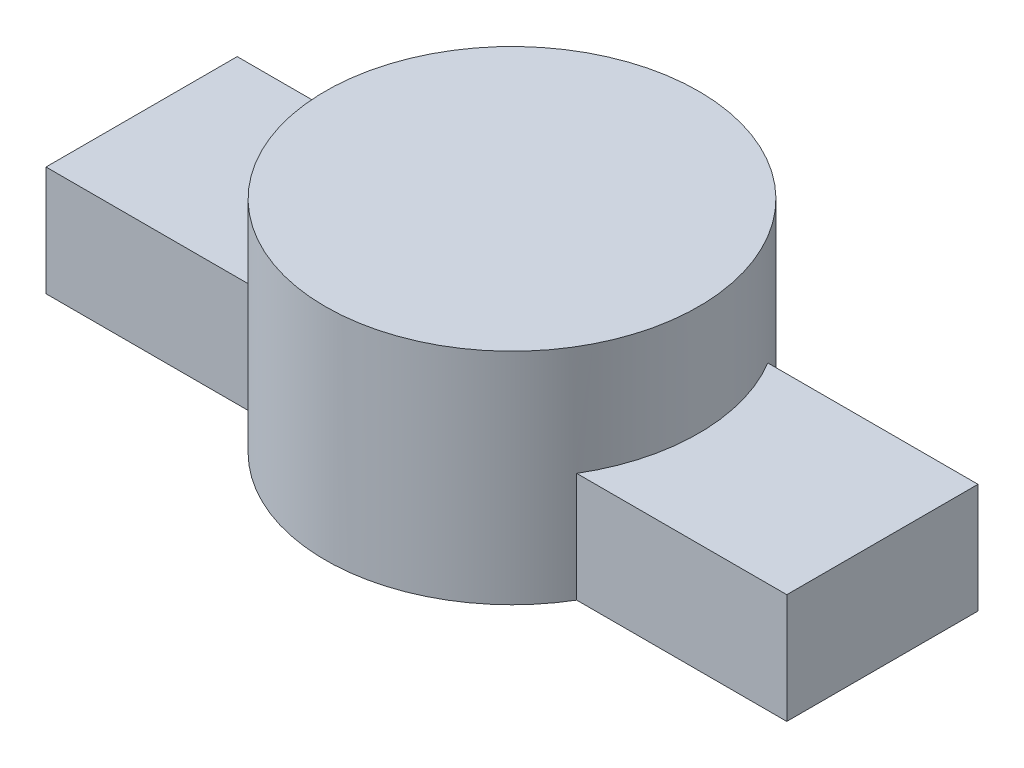
ISO-10303-21;
HEADER;
FILE_DESCRIPTION(('STEP AP214'),'2;1');
FILE_NAME('part.step','',(''),(''),'','','');
FILE_SCHEMA(('AUTOMOTIVE_DESIGN { 1 0 10303 214 1 1 1 1 }'));
ENDSEC;
DATA;
#1=APPLICATION_CONTEXT('core data for automotive mechanical design processes');
#2=APPLICATION_PROTOCOL_DEFINITION('international standard','automotive_design',2000,#1);
#3=PRODUCT_CONTEXT('',#1,'mechanical');
#4=PRODUCT('Part','Part','',(#3));
#5=PRODUCT_RELATED_PRODUCT_CATEGORY('part','',(#4));
#6=PRODUCT_DEFINITION_FORMATION('','',#4);
#7=PRODUCT_DEFINITION_CONTEXT('part definition',#1,'design');
#8=PRODUCT_DEFINITION('design','',#6,#7);
#9=PRODUCT_DEFINITION_SHAPE('','',#8);
#10=(LENGTH_UNIT() NAMED_UNIT(*) SI_UNIT(.MILLI.,.METRE.));
#11=(NAMED_UNIT(*) PLANE_ANGLE_UNIT() SI_UNIT($,.RADIAN.));
#12=(NAMED_UNIT(*) SI_UNIT($,.STERADIAN.) SOLID_ANGLE_UNIT());
#13=UNCERTAINTY_MEASURE_WITH_UNIT(LENGTH_MEASURE(1.E-05),#10,'distance_accuracy_value','');
#14=(GEOMETRIC_REPRESENTATION_CONTEXT(3) GLOBAL_UNCERTAINTY_ASSIGNED_CONTEXT((#13)) GLOBAL_UNIT_ASSIGNED_CONTEXT((#10,
#11,#12)) REPRESENTATION_CONTEXT('',''));
#15=CARTESIAN_POINT('',(0.,0.,0.));
#16=DIRECTION('',(0.,0.,1.));
#17=DIRECTION('',(1.,0.,0.));
#18=AXIS2_PLACEMENT_3D('',#15,#16,#17);
#19=CARTESIAN_POINT('',(0.,10.,0.));
#20=DIRECTION('',(0.,-1.,0.));
#21=DIRECTION('',(0.,0.,-1.));
#22=AXIS2_PLACEMENT_3D('',#19,#20,#21);
#23=CYLINDRICAL_SURFACE('',#22,8.5);
#24=CARTESIAN_POINT('',(0.,5.,0.));
#25=DIRECTION('',(0.,-1.,0.));
#26=DIRECTION('',(0.,0.,-1.));
#27=AXIS2_PLACEMENT_3D('',#24,#25,#26);
#28=CIRCLE('',#27,8.5);
#29=CARTESIAN_POINT('',(7.30019045893313,5.,-4.35398889104022));
#30=VERTEX_POINT('',#29);
#31=CARTESIAN_POINT('',(7.30019045893313,5.,4.35398889104022));
#32=VERTEX_POINT('',#31);
#33=EDGE_CURVE('E11',#30,#32,#28,.T.);
#34=ORIENTED_EDGE('',*,*,#33,.F.);
#35=DIRECTION('',(0.,-1.,0.));
#36=VECTOR('',#35,1.);
#37=CARTESIAN_POINT('',(7.30019045893313,10.,-4.35398889104022));
#38=LINE('',#37,#36);
#39=CARTESIAN_POINT('',(7.30019045893314,0.,-4.35398889104022));
#40=VERTEX_POINT('',#39);
#41=EDGE_CURVE('E149',#30,#40,#38,.T.);
#42=ORIENTED_EDGE('',*,*,#41,.T.);
#43=CARTESIAN_POINT('',(0.,0.,0.));
#44=DIRECTION('',(0.,1.,0.));
#45=DIRECTION('',(0.,0.,1.));
#46=AXIS2_PLACEMENT_3D('',#43,#44,#45);
#47=CIRCLE('',#46,8.5);
#48=CARTESIAN_POINT('',(-7.30019045893313,0.,-4.35398889104022));
#49=VERTEX_POINT('',#48);
#50=EDGE_CURVE('E154',#40,#49,#47,.T.);
#51=ORIENTED_EDGE('',*,*,#50,.T.);
#52=DIRECTION('',(0.,-1.,0.));
#53=VECTOR('',#52,1.);
#54=CARTESIAN_POINT('',(-7.30019045893313,10.,-4.35398889104022));
#55=LINE('',#54,#53);
#56=CARTESIAN_POINT('',(-7.30019045893313,5.,-4.35398889104022));
#57=VERTEX_POINT('',#56);
#58=EDGE_CURVE('E147',#49,#57,#55,.F.);
#59=ORIENTED_EDGE('',*,*,#58,.T.);
#60=CARTESIAN_POINT('',(-7.30019045893313,5.,4.35398889104022));
#61=VERTEX_POINT('',#60);
#62=EDGE_CURVE('E37',#61,#57,#28,.T.);
#63=ORIENTED_EDGE('',*,*,#62,.F.);
#64=DIRECTION('',(0.,-1.,0.));
#65=VECTOR('',#64,1.);
#66=CARTESIAN_POINT('',(-7.30019045893313,10.,4.35398889104022));
#67=LINE('',#66,#65);
#68=CARTESIAN_POINT('',(-7.30019045893314,0.,4.35398889104022));
#69=VERTEX_POINT('',#68);
#70=EDGE_CURVE('E144',#61,#69,#67,.T.);
#71=ORIENTED_EDGE('',*,*,#70,.T.);
#72=CARTESIAN_POINT('',(7.30019045893313,0.,4.35398889104022));
#73=VERTEX_POINT('',#72);
#74=EDGE_CURVE('E151',#69,#73,#47,.T.);
#75=ORIENTED_EDGE('',*,*,#74,.T.);
#76=DIRECTION('',(0.,-1.,0.));
#77=VECTOR('',#76,1.);
#78=CARTESIAN_POINT('',(7.30019045893313,10.,4.35398889104022));
#79=LINE('',#78,#77);
#80=EDGE_CURVE('E48',#73,#32,#79,.F.);
#81=ORIENTED_EDGE('',*,*,#80,.T.);
#82=EDGE_LOOP('',(#34,#42,#51,#59,#63,#71,#75,#81));
#83=FACE_BOUND('',#82,.T.);
#84=CARTESIAN_POINT('',(0.,10.,0.));
#85=DIRECTION('',(0.,1.,0.));
#86=DIRECTION('',(0.,0.,1.));
#87=AXIS2_PLACEMENT_3D('',#84,#85,#86);
#88=CIRCLE('',#87,8.5);
#89=CARTESIAN_POINT('',(0.,10.,8.5));
#90=VERTEX_POINT('',#89);
#91=EDGE_CURVE('E152',#90,#90,#88,.T.);
#92=ORIENTED_EDGE('',*,*,#91,.F.);
#93=EDGE_LOOP('',(#92));
#94=FACE_BOUND('',#93,.T.);
#95=ADVANCED_FACE('F34',(#83,#94),#23,.T.);
#96=CARTESIAN_POINT('',(0.,10.,0.));
#97=DIRECTION('',(0.,1.,0.));
#98=DIRECTION('',(0.,0.,1.));
#99=AXIS2_PLACEMENT_3D('',#96,#97,#98);
#100=PLANE('',#99);
#101=ORIENTED_EDGE('',*,*,#91,.T.);
#102=EDGE_LOOP('',(#101));
#103=FACE_BOUND('',#102,.T.);
#104=ADVANCED_FACE('F190',(#103),#100,.T.);
#105=CARTESIAN_POINT('',(0.,0.,0.));
#106=DIRECTION('',(0.,1.,0.));
#107=DIRECTION('',(0.,0.,1.));
#108=AXIS2_PLACEMENT_3D('',#105,#106,#107);
#109=PLANE('',#108);
#110=ORIENTED_EDGE('',*,*,#74,.F.);
#111=DIRECTION('',(-1.,0.,0.));
#112=VECTOR('',#111,1.);
#113=CARTESIAN_POINT('',(-16.8691644639445,0.,4.35398889104022));
#114=LINE('',#113,#112);
#115=CARTESIAN_POINT('',(-16.8691644639445,0.,4.35398889104022));
#116=VERTEX_POINT('',#115);
#117=EDGE_CURVE('E133',#69,#116,#114,.T.);
#118=ORIENTED_EDGE('',*,*,#117,.T.);
#119=DIRECTION('',(0.,0.,-1.));
#120=VECTOR('',#119,1.);
#121=CARTESIAN_POINT('',(-16.8691644639445,0.,4.35398889104022));
#122=LINE('',#121,#120);
#123=CARTESIAN_POINT('',(-16.8691644639445,0.,-4.35398889104022));
#124=VERTEX_POINT('',#123);
#125=EDGE_CURVE('E135',#116,#124,#122,.T.);
#126=ORIENTED_EDGE('',*,*,#125,.T.);
#127=DIRECTION('',(1.,0.,0.));
#128=VECTOR('',#127,1.);
#129=CARTESIAN_POINT('',(-16.8691644639445,0.,-4.35398889104022));
#130=LINE('',#129,#128);
#131=EDGE_CURVE('E120',#124,#49,#130,.T.);
#132=ORIENTED_EDGE('',*,*,#131,.T.);
#133=ORIENTED_EDGE('',*,*,#50,.F.);
#134=CARTESIAN_POINT('',(16.8691644639445,0.,-4.35398889104022));
#135=VERTEX_POINT('',#134);
#136=EDGE_CURVE('E123',#40,#135,#130,.T.);
#137=ORIENTED_EDGE('',*,*,#136,.T.);
#138=DIRECTION('',(0.,0.,1.));
#139=VECTOR('',#138,1.);
#140=CARTESIAN_POINT('',(16.8691644639445,0.,4.35398889104022));
#141=LINE('',#140,#139);
#142=CARTESIAN_POINT('',(16.8691644639445,0.,4.35398889104022));
#143=VERTEX_POINT('',#142);
#144=EDGE_CURVE('E131',#135,#143,#141,.T.);
#145=ORIENTED_EDGE('',*,*,#144,.T.);
#146=EDGE_CURVE('E100',#143,#73,#114,.T.);
#147=ORIENTED_EDGE('',*,*,#146,.T.);
#148=EDGE_LOOP('',(#110,#118,#126,#132,#133,#137,#145,#147));
#149=FACE_BOUND('',#148,.T.);
#150=ADVANCED_FACE('F164',(#149),#109,.F.);
#151=CARTESIAN_POINT('',(-16.8691644639445,5.,4.35398889104022));
#152=DIRECTION('',(-1.,0.,0.));
#153=DIRECTION('',(0.,0.,1.));
#154=AXIS2_PLACEMENT_3D('',#151,#152,#153);
#155=PLANE('',#154);
#156=ORIENTED_EDGE('',*,*,#125,.F.);
#157=DIRECTION('',(0.,-1.,0.));
#158=VECTOR('',#157,1.);
#159=CARTESIAN_POINT('',(-16.8691644639445,5.,4.35398889104022));
#160=LINE('',#159,#158);
#161=CARTESIAN_POINT('',(-16.8691644639445,5.,4.35398889104022));
#162=VERTEX_POINT('',#161);
#163=EDGE_CURVE('E105',#162,#116,#160,.T.);
#164=ORIENTED_EDGE('',*,*,#163,.F.);
#165=DIRECTION('',(0.,0.,-1.));
#166=VECTOR('',#165,1.);
#167=CARTESIAN_POINT('',(-16.8691644639445,5.,4.35398889104022));
#168=LINE('',#167,#166);
#169=CARTESIAN_POINT('',(-16.8691644639445,5.,-4.35398889104022));
#170=VERTEX_POINT('',#169);
#171=EDGE_CURVE('E113',#162,#170,#168,.T.);
#172=ORIENTED_EDGE('',*,*,#171,.T.);
#173=DIRECTION('',(0.,-1.,0.));
#174=VECTOR('',#173,1.);
#175=CARTESIAN_POINT('',(-16.8691644639445,5.,-4.35398889104022));
#176=LINE('',#175,#174);
#177=EDGE_CURVE('E139',#170,#124,#176,.T.);
#178=ORIENTED_EDGE('',*,*,#177,.T.);
#179=EDGE_LOOP('',(#156,#164,#172,#178));
#180=FACE_BOUND('',#179,.T.);
#181=ADVANCED_FACE('F169',(#180),#155,.T.);
#182=CARTESIAN_POINT('',(0.,5.,0.));
#183=DIRECTION('',(0.,-1.,0.));
#184=DIRECTION('',(0.,0.,-1.));
#185=AXIS2_PLACEMENT_3D('',#182,#183,#184);
#186=PLANE('',#185);
#187=DIRECTION('',(-1.,0.,0.));
#188=VECTOR('',#187,1.);
#189=CARTESIAN_POINT('',(-16.8691644639445,5.,4.35398889104022));
#190=LINE('',#189,#188);
#191=EDGE_CURVE('E114',#61,#162,#190,.T.);
#192=ORIENTED_EDGE('',*,*,#191,.F.);
#193=ORIENTED_EDGE('',*,*,#62,.T.);
#194=DIRECTION('',(1.,0.,0.));
#195=VECTOR('',#194,1.);
#196=CARTESIAN_POINT('',(-16.8691644639445,5.,-4.35398889104022));
#197=LINE('',#196,#195);
#198=EDGE_CURVE('E106',#170,#57,#197,.T.);
#199=ORIENTED_EDGE('',*,*,#198,.F.);
#200=ORIENTED_EDGE('',*,*,#171,.F.);
#201=EDGE_LOOP('',(#192,#193,#199,#200));
#202=FACE_BOUND('',#201,.T.);
#203=ADVANCED_FACE('F173',(#202),#186,.F.);
#204=CARTESIAN_POINT('',(-16.8691644639445,5.,4.35398889104022));
#205=DIRECTION('',(0.,0.,1.));
#206=DIRECTION('',(1.,0.,0.));
#207=AXIS2_PLACEMENT_3D('',#204,#205,#206);
#208=PLANE('',#207);
#209=ORIENTED_EDGE('',*,*,#70,.F.);
#210=ORIENTED_EDGE('',*,*,#191,.T.);
#211=ORIENTED_EDGE('',*,*,#163,.T.);
#212=ORIENTED_EDGE('',*,*,#117,.F.);
#213=EDGE_LOOP('',(#209,#210,#211,#212));
#214=FACE_BOUND('',#213,.T.);
#215=ADVANCED_FACE('F176',(#214),#208,.T.);
#216=CARTESIAN_POINT('',(-16.8691644639445,5.,-4.35398889104022));
#217=DIRECTION('',(0.,0.,-1.));
#218=DIRECTION('',(-1.,0.,0.));
#219=AXIS2_PLACEMENT_3D('',#216,#217,#218);
#220=PLANE('',#219);
#221=ORIENTED_EDGE('',*,*,#58,.F.);
#222=ORIENTED_EDGE('',*,*,#131,.F.);
#223=ORIENTED_EDGE('',*,*,#177,.F.);
#224=ORIENTED_EDGE('',*,*,#198,.T.);
#225=EDGE_LOOP('',(#221,#222,#223,#224));
#226=FACE_BOUND('',#225,.T.);
#227=ADVANCED_FACE('F162',(#226),#220,.T.);
#228=CARTESIAN_POINT('',(16.8691644639445,5.,-4.35398889104022));
#229=VERTEX_POINT('',#228);
#230=EDGE_CURVE('E128',#30,#229,#197,.T.);
#231=ORIENTED_EDGE('',*,*,#230,.F.);
#232=ORIENTED_EDGE('',*,*,#33,.T.);
#233=CARTESIAN_POINT('',(16.8691644639445,5.,4.35398889104022));
#234=VERTEX_POINT('',#233);
#235=EDGE_CURVE('E98',#234,#32,#190,.T.);
#236=ORIENTED_EDGE('',*,*,#235,.F.);
#237=DIRECTION('',(0.,0.,1.));
#238=VECTOR('',#237,1.);
#239=CARTESIAN_POINT('',(16.8691644639445,5.,4.35398889104022));
#240=LINE('',#239,#238);
#241=EDGE_CURVE('E112',#229,#234,#240,.T.);
#242=ORIENTED_EDGE('',*,*,#241,.F.);
#243=EDGE_LOOP('',(#231,#232,#236,#242));
#244=FACE_BOUND('',#243,.T.);
#245=ADVANCED_FACE('F111',(#244),#186,.F.);
#246=ORIENTED_EDGE('',*,*,#41,.F.);
#247=ORIENTED_EDGE('',*,*,#230,.T.);
#248=DIRECTION('',(0.,-1.,0.));
#249=VECTOR('',#248,1.);
#250=CARTESIAN_POINT('',(16.8691644639445,5.,-4.35398889104022));
#251=LINE('',#250,#249);
#252=EDGE_CURVE('E119',#229,#135,#251,.T.);
#253=ORIENTED_EDGE('',*,*,#252,.T.);
#254=ORIENTED_EDGE('',*,*,#136,.F.);
#255=EDGE_LOOP('',(#246,#247,#253,#254));
#256=FACE_BOUND('',#255,.T.);
#257=ADVANCED_FACE('F184',(#256),#220,.T.);
#258=ORIENTED_EDGE('',*,*,#80,.F.);
#259=ORIENTED_EDGE('',*,*,#146,.F.);
#260=DIRECTION('',(0.,-1.,0.));
#261=VECTOR('',#260,1.);
#262=CARTESIAN_POINT('',(16.8691644639445,5.,4.35398889104022));
#263=LINE('',#262,#261);
#264=EDGE_CURVE('E95',#234,#143,#263,.T.);
#265=ORIENTED_EDGE('',*,*,#264,.F.);
#266=ORIENTED_EDGE('',*,*,#235,.T.);
#267=EDGE_LOOP('',(#258,#259,#265,#266));
#268=FACE_BOUND('',#267,.T.);
#269=ADVANCED_FACE('F97',(#268),#208,.T.);
#270=CARTESIAN_POINT('',(16.8691644639445,5.,4.35398889104022));
#271=DIRECTION('',(1.,0.,0.));
#272=DIRECTION('',(0.,0.,-1.));
#273=AXIS2_PLACEMENT_3D('',#270,#271,#272);
#274=PLANE('',#273);
#275=ORIENTED_EDGE('',*,*,#144,.F.);
#276=ORIENTED_EDGE('',*,*,#252,.F.);
#277=ORIENTED_EDGE('',*,*,#241,.T.);
#278=ORIENTED_EDGE('',*,*,#264,.T.);
#279=EDGE_LOOP('',(#275,#276,#277,#278));
#280=FACE_BOUND('',#279,.T.);
#281=ADVANCED_FACE('F117',(#280),#274,.T.);
#282=CLOSED_SHELL('',(#95,#104,#150,#181,#203,#215,#227,#245,#257,#269,#281));
#283=MANIFOLD_SOLID_BREP('B2',#282);
#284=ADVANCED_BREP_SHAPE_REPRESENTATION('',(#18,#283),#14);
#285=SHAPE_DEFINITION_REPRESENTATION(#9,#284);
ENDSEC;
END-ISO-10303-21;
